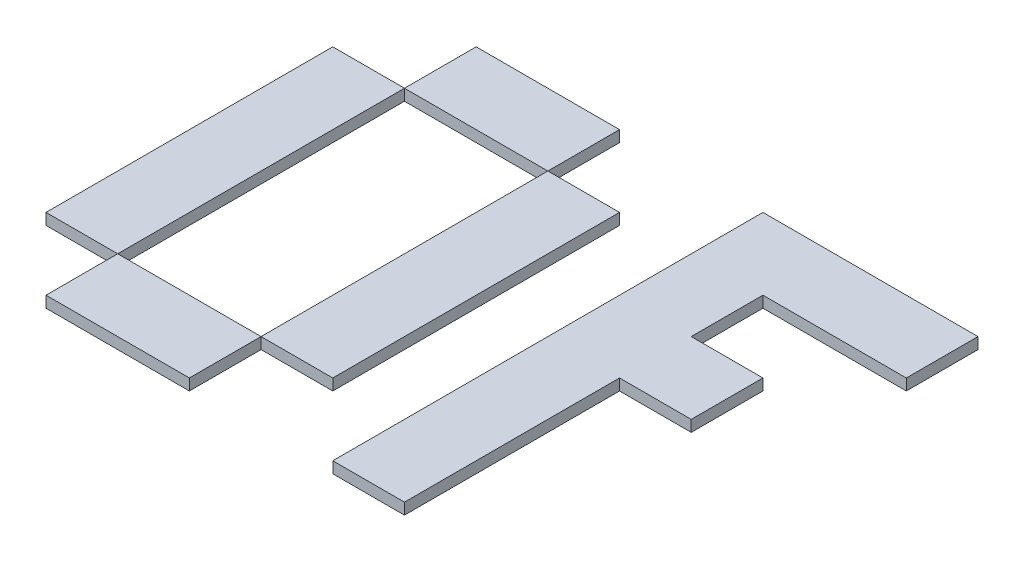
ISO-10303-21;
HEADER;
FILE_DESCRIPTION(('STEP AP214'),'2;1');
FILE_NAME('part.step','',(''),(''),'','','');
FILE_SCHEMA(('AUTOMOTIVE_DESIGN { 1 0 10303 214 1 1 1 1 }'));
ENDSEC;
DATA;
#1=APPLICATION_CONTEXT('core data for automotive mechanical design processes');
#2=APPLICATION_PROTOCOL_DEFINITION('international standard','automotive_design',2000,#1);
#3=PRODUCT_CONTEXT('',#1,'mechanical');
#4=PRODUCT('Part','Part','',(#3));
#5=PRODUCT_RELATED_PRODUCT_CATEGORY('part','',(#4));
#6=PRODUCT_DEFINITION_FORMATION('','',#4);
#7=PRODUCT_DEFINITION_CONTEXT('part definition',#1,'design');
#8=PRODUCT_DEFINITION('design','',#6,#7);
#9=PRODUCT_DEFINITION_SHAPE('','',#8);
#10=(LENGTH_UNIT() NAMED_UNIT(*) SI_UNIT(.MILLI.,.METRE.));
#11=(NAMED_UNIT(*) PLANE_ANGLE_UNIT() SI_UNIT($,.RADIAN.));
#12=(NAMED_UNIT(*) SI_UNIT($,.STERADIAN.) SOLID_ANGLE_UNIT());
#13=UNCERTAINTY_MEASURE_WITH_UNIT(LENGTH_MEASURE(1.E-05),#10,'distance_accuracy_value','');
#14=(GEOMETRIC_REPRESENTATION_CONTEXT(3) GLOBAL_UNCERTAINTY_ASSIGNED_CONTEXT((#13)) GLOBAL_UNIT_ASSIGNED_CONTEXT((#10,
#11,#12)) REPRESENTATION_CONTEXT('',''));
#15=CARTESIAN_POINT('',(0.,0.,0.));
#16=DIRECTION('',(0.,0.,1.));
#17=DIRECTION('',(1.,0.,0.));
#18=AXIS2_PLACEMENT_3D('',#15,#16,#17);
#19=CARTESIAN_POINT('',(0.,0.,0.));
#20=DIRECTION('',(0.,-1.,0.));
#21=DIRECTION('',(0.,0.,-1.));
#22=AXIS2_PLACEMENT_3D('',#19,#20,#21);
#23=PLANE('',#22);
#24=DIRECTION('',(0.,0.,1.));
#25=VECTOR('',#24,1.);
#26=CARTESIAN_POINT('',(25.4,0.,-127.));
#27=LINE('',#26,#25);
#28=CARTESIAN_POINT('',(25.4,0.,-127.));
#29=VERTEX_POINT('',#28);
#30=CARTESIAN_POINT('',(25.4,0.,-76.2));
#31=VERTEX_POINT('',#30);
#32=EDGE_CURVE('E107',#29,#31,#27,.T.);
#33=ORIENTED_EDGE('',*,*,#32,.T.);
#34=DIRECTION('',(1.,0.,0.));
#35=VECTOR('',#34,1.);
#36=CARTESIAN_POINT('',(0.,0.,-76.2));
#37=LINE('',#36,#35);
#38=CARTESIAN_POINT('',(12.7,0.,-76.2));
#39=VERTEX_POINT('',#38);
#40=EDGE_CURVE('E96',#39,#31,#37,.T.);
#41=ORIENTED_EDGE('',*,*,#40,.F.);
#42=DIRECTION('',(0.,0.,1.));
#43=VECTOR('',#42,1.);
#44=CARTESIAN_POINT('',(12.7,0.,0.));
#45=LINE('',#44,#43);
#46=CARTESIAN_POINT('',(12.7,0.,-127.));
#47=VERTEX_POINT('',#46);
#48=EDGE_CURVE('E111',#47,#39,#45,.T.);
#49=ORIENTED_EDGE('',*,*,#48,.F.);
#50=DIRECTION('',(1.,0.,0.));
#51=VECTOR('',#50,1.);
#52=CARTESIAN_POINT('',(0.,0.,-127.));
#53=LINE('',#52,#51);
#54=EDGE_CURVE('E102',#47,#29,#53,.T.);
#55=ORIENTED_EDGE('',*,*,#54,.T.);
#56=EDGE_LOOP('',(#33,#41,#49,#55));
#57=FACE_BOUND('',#56,.T.);
#58=ADVANCED_FACE('F50',(#57),#23,.T.);
#59=CARTESIAN_POINT('',(0.,2.,0.));
#60=DIRECTION('',(0.,-1.,0.));
#61=DIRECTION('',(0.,0.,-1.));
#62=AXIS2_PLACEMENT_3D('',#59,#60,#61);
#63=PLANE('',#62);
#64=DIRECTION('',(1.,0.,0.));
#65=VECTOR('',#64,1.);
#66=CARTESIAN_POINT('',(0.,2.,-76.2));
#67=LINE('',#66,#65);
#68=CARTESIAN_POINT('',(12.7,2.,-76.2));
#69=VERTEX_POINT('',#68);
#70=CARTESIAN_POINT('',(25.4,2.,-76.2));
#71=VERTEX_POINT('',#70);
#72=EDGE_CURVE('E93',#69,#71,#67,.T.);
#73=ORIENTED_EDGE('',*,*,#72,.T.);
#74=DIRECTION('',(0.,0.,1.));
#75=VECTOR('',#74,1.);
#76=CARTESIAN_POINT('',(25.4,2.,-127.));
#77=LINE('',#76,#75);
#78=CARTESIAN_POINT('',(25.4,2.,-127.));
#79=VERTEX_POINT('',#78);
#80=EDGE_CURVE('E59',#79,#71,#77,.T.);
#81=ORIENTED_EDGE('',*,*,#80,.F.);
#82=DIRECTION('',(1.,0.,0.));
#83=VECTOR('',#82,1.);
#84=CARTESIAN_POINT('',(0.,2.,-127.));
#85=LINE('',#84,#83);
#86=CARTESIAN_POINT('',(12.7,2.,-127.));
#87=VERTEX_POINT('',#86);
#88=EDGE_CURVE('E104',#87,#79,#85,.T.);
#89=ORIENTED_EDGE('',*,*,#88,.F.);
#90=DIRECTION('',(0.,0.,1.));
#91=VECTOR('',#90,1.);
#92=CARTESIAN_POINT('',(12.7,2.,0.));
#93=LINE('',#92,#91);
#94=EDGE_CURVE('E101',#87,#69,#93,.T.);
#95=ORIENTED_EDGE('',*,*,#94,.T.);
#96=EDGE_LOOP('',(#73,#81,#89,#95));
#97=FACE_BOUND('',#96,.T.);
#98=ADVANCED_FACE('F99',(#97),#63,.F.);
#99=CARTESIAN_POINT('',(0.,0.,-127.));
#100=DIRECTION('',(0.,0.,1.));
#101=DIRECTION('',(1.,0.,0.));
#102=AXIS2_PLACEMENT_3D('',#99,#100,#101);
#103=PLANE('',#102);
#104=ORIENTED_EDGE('',*,*,#88,.T.);
#105=DIRECTION('',(0.,1.,0.));
#106=VECTOR('',#105,1.);
#107=CARTESIAN_POINT('',(25.4,0.,-127.));
#108=LINE('',#107,#106);
#109=EDGE_CURVE('E12',#29,#79,#108,.T.);
#110=ORIENTED_EDGE('',*,*,#109,.F.);
#111=ORIENTED_EDGE('',*,*,#54,.F.);
#112=DIRECTION('',(0.,1.,0.));
#113=VECTOR('',#112,1.);
#114=CARTESIAN_POINT('',(12.7,0.,-127.));
#115=LINE('',#114,#113);
#116=EDGE_CURVE('E114',#47,#87,#115,.T.);
#117=ORIENTED_EDGE('',*,*,#116,.T.);
#118=EDGE_LOOP('',(#104,#110,#111,#117));
#119=FACE_BOUND('',#118,.T.);
#120=ADVANCED_FACE('F120',(#119),#103,.F.);
#121=CARTESIAN_POINT('',(12.7,0.,0.));
#122=DIRECTION('',(-1.,0.,0.));
#123=DIRECTION('',(0.,0.,1.));
#124=AXIS2_PLACEMENT_3D('',#121,#122,#123);
#125=PLANE('',#124);
#126=ORIENTED_EDGE('',*,*,#94,.F.);
#127=ORIENTED_EDGE('',*,*,#116,.F.);
#128=ORIENTED_EDGE('',*,*,#48,.T.);
#129=DIRECTION('',(0.,1.,0.));
#130=VECTOR('',#129,1.);
#131=CARTESIAN_POINT('',(12.7,0.,-76.2));
#132=LINE('',#131,#130);
#133=EDGE_CURVE('E113',#39,#69,#132,.T.);
#134=ORIENTED_EDGE('',*,*,#133,.T.);
#135=EDGE_LOOP('',(#126,#127,#128,#134));
#136=FACE_BOUND('',#135,.T.);
#137=ADVANCED_FACE('F124',(#136),#125,.T.);
#138=CARTESIAN_POINT('',(0.,0.,-76.2));
#139=DIRECTION('',(0.,0.,1.));
#140=DIRECTION('',(1.,0.,0.));
#141=AXIS2_PLACEMENT_3D('',#138,#139,#140);
#142=PLANE('',#141);
#143=ORIENTED_EDGE('',*,*,#72,.F.);
#144=ORIENTED_EDGE('',*,*,#133,.F.);
#145=ORIENTED_EDGE('',*,*,#40,.T.);
#146=DIRECTION('',(0.,1.,0.));
#147=VECTOR('',#146,1.);
#148=CARTESIAN_POINT('',(25.4,0.,-76.2));
#149=LINE('',#148,#147);
#150=EDGE_CURVE('E53',#31,#71,#149,.T.);
#151=ORIENTED_EDGE('',*,*,#150,.T.);
#152=EDGE_LOOP('',(#143,#144,#145,#151));
#153=FACE_BOUND('',#152,.T.);
#154=ADVANCED_FACE('F91',(#153),#142,.T.);
#155=CARTESIAN_POINT('',(25.4,0.,-127.));
#156=DIRECTION('',(-1.,0.,0.));
#157=DIRECTION('',(0.,0.,1.));
#158=AXIS2_PLACEMENT_3D('',#155,#156,#157);
#159=PLANE('',#158);
#160=ORIENTED_EDGE('',*,*,#80,.T.);
#161=ORIENTED_EDGE('',*,*,#150,.F.);
#162=ORIENTED_EDGE('',*,*,#32,.F.);
#163=ORIENTED_EDGE('',*,*,#109,.T.);
#164=EDGE_LOOP('',(#160,#161,#162,#163));
#165=FACE_BOUND('',#164,.T.);
#166=ADVANCED_FACE('F84',(#165),#159,.F.);
#167=CLOSED_SHELL('',(#58,#98,#120,#137,#154,#166));
#168=MANIFOLD_SOLID_BREP('B2',#167);
#169=CARTESIAN_POINT('',(0.,0.,-63.5));
#170=DIRECTION('',(0.,0.,1.));
#171=DIRECTION('',(1.,0.,0.));
#172=AXIS2_PLACEMENT_3D('',#169,#170,#171);
#173=PLANE('',#172);
#174=DIRECTION('',(1.,0.,0.));
#175=VECTOR('',#174,1.);
#176=CARTESIAN_POINT('',(0.,2.,-63.5));
#177=LINE('',#176,#175);
#178=CARTESIAN_POINT('',(25.4,2.,-63.5));
#179=VERTEX_POINT('',#178);
#180=CARTESIAN_POINT('',(50.8,2.,-63.5));
#181=VERTEX_POINT('',#180);
#182=EDGE_CURVE('E259',#179,#181,#177,.T.);
#183=ORIENTED_EDGE('',*,*,#182,.F.);
#184=DIRECTION('',(0.,1.,0.));
#185=VECTOR('',#184,1.);
#186=CARTESIAN_POINT('',(25.4,0.,-63.5));
#187=LINE('',#186,#185);
#188=CARTESIAN_POINT('',(25.4,0.,-63.5));
#189=VERTEX_POINT('',#188);
#190=EDGE_CURVE('E249',#189,#179,#187,.T.);
#191=ORIENTED_EDGE('',*,*,#190,.F.);
#192=DIRECTION('',(1.,0.,0.));
#193=VECTOR('',#192,1.);
#194=CARTESIAN_POINT('',(0.,0.,-63.5));
#195=LINE('',#194,#193);
#196=CARTESIAN_POINT('',(50.8,0.,-63.5));
#197=VERTEX_POINT('',#196);
#198=EDGE_CURVE('E255',#189,#197,#195,.T.);
#199=ORIENTED_EDGE('',*,*,#198,.T.);
#200=DIRECTION('',(0.,1.,0.));
#201=VECTOR('',#200,1.);
#202=CARTESIAN_POINT('',(50.8,0.,-63.5));
#203=LINE('',#202,#201);
#204=EDGE_CURVE('E244',#197,#181,#203,.T.);
#205=ORIENTED_EDGE('',*,*,#204,.T.);
#206=EDGE_LOOP('',(#183,#191,#199,#205));
#207=FACE_BOUND('',#206,.T.);
#208=ADVANCED_FACE('F196',(#207),#173,.T.);
#209=CARTESIAN_POINT('',(0.,2.,0.));
#210=DIRECTION('',(0.,-1.,0.));
#211=DIRECTION('',(0.,0.,-1.));
#212=AXIS2_PLACEMENT_3D('',#209,#210,#211);
#213=PLANE('',#212);
#214=DIRECTION('',(0.,0.,1.));
#215=VECTOR('',#214,1.);
#216=CARTESIAN_POINT('',(50.8,2.,0.));
#217=LINE('',#216,#215);
#218=CARTESIAN_POINT('',(50.8,2.,-76.2));
#219=VERTEX_POINT('',#218);
#220=EDGE_CURVE('E239',#219,#181,#217,.T.);
#221=ORIENTED_EDGE('',*,*,#220,.F.);
#222=DIRECTION('',(1.,0.,0.));
#223=VECTOR('',#222,1.);
#224=CARTESIAN_POINT('',(25.4,2.,-76.2));
#225=LINE('',#224,#223);
#226=CARTESIAN_POINT('',(25.4,2.,-76.2));
#227=VERTEX_POINT('',#226);
#228=EDGE_CURVE('E205',#227,#219,#225,.T.);
#229=ORIENTED_EDGE('',*,*,#228,.F.);
#230=DIRECTION('',(0.,0.,1.));
#231=VECTOR('',#230,1.);
#232=CARTESIAN_POINT('',(25.4,2.,0.));
#233=LINE('',#232,#231);
#234=EDGE_CURVE('E262',#227,#179,#233,.T.);
#235=ORIENTED_EDGE('',*,*,#234,.T.);
#236=ORIENTED_EDGE('',*,*,#182,.T.);
#237=EDGE_LOOP('',(#221,#229,#235,#236));
#238=FACE_BOUND('',#237,.T.);
#239=ADVANCED_FACE('F268',(#238),#213,.F.);
#240=CARTESIAN_POINT('',(50.8,0.,0.));
#241=DIRECTION('',(-1.,0.,0.));
#242=DIRECTION('',(0.,0.,1.));
#243=AXIS2_PLACEMENT_3D('',#240,#241,#242);
#244=PLANE('',#243);
#245=ORIENTED_EDGE('',*,*,#220,.T.);
#246=ORIENTED_EDGE('',*,*,#204,.F.);
#247=DIRECTION('',(0.,0.,1.));
#248=VECTOR('',#247,1.);
#249=CARTESIAN_POINT('',(50.8,0.,0.));
#250=LINE('',#249,#248);
#251=CARTESIAN_POINT('',(50.8,0.,-76.2));
#252=VERTEX_POINT('',#251);
#253=EDGE_CURVE('E242',#252,#197,#250,.T.);
#254=ORIENTED_EDGE('',*,*,#253,.F.);
#255=DIRECTION('',(0.,1.,0.));
#256=VECTOR('',#255,1.);
#257=CARTESIAN_POINT('',(50.8,0.,-76.2));
#258=LINE('',#257,#256);
#259=EDGE_CURVE('E230',#252,#219,#258,.T.);
#260=ORIENTED_EDGE('',*,*,#259,.T.);
#261=EDGE_LOOP('',(#245,#246,#254,#260));
#262=FACE_BOUND('',#261,.T.);
#263=ADVANCED_FACE('F243',(#262),#244,.F.);
#264=CARTESIAN_POINT('',(25.4,0.,0.));
#265=DIRECTION('',(-1.,0.,0.));
#266=DIRECTION('',(0.,0.,1.));
#267=AXIS2_PLACEMENT_3D('',#264,#265,#266);
#268=PLANE('',#267);
#269=ORIENTED_EDGE('',*,*,#234,.F.);
#270=DIRECTION('',(0.,1.,0.));
#271=VECTOR('',#270,1.);
#272=CARTESIAN_POINT('',(25.4,0.,-76.2));
#273=LINE('',#272,#271);
#274=CARTESIAN_POINT('',(25.4,0.,-76.2));
#275=VERTEX_POINT('',#274);
#276=EDGE_CURVE('E48',#275,#227,#273,.T.);
#277=ORIENTED_EDGE('',*,*,#276,.F.);
#278=DIRECTION('',(0.,0.,1.));
#279=VECTOR('',#278,1.);
#280=CARTESIAN_POINT('',(25.4,0.,0.));
#281=LINE('',#280,#279);
#282=EDGE_CURVE('E238',#275,#189,#281,.T.);
#283=ORIENTED_EDGE('',*,*,#282,.T.);
#284=ORIENTED_EDGE('',*,*,#190,.T.);
#285=EDGE_LOOP('',(#269,#277,#283,#284));
#286=FACE_BOUND('',#285,.T.);
#287=ADVANCED_FACE('F270',(#286),#268,.T.);
#288=CARTESIAN_POINT('',(0.,0.,0.));
#289=DIRECTION('',(0.,-1.,0.));
#290=DIRECTION('',(0.,0.,-1.));
#291=AXIS2_PLACEMENT_3D('',#288,#289,#290);
#292=PLANE('',#291);
#293=DIRECTION('',(1.,0.,0.));
#294=VECTOR('',#293,1.);
#295=CARTESIAN_POINT('',(25.4,0.,-76.2));
#296=LINE('',#295,#294);
#297=EDGE_CURVE('E234',#275,#252,#296,.T.);
#298=ORIENTED_EDGE('',*,*,#297,.T.);
#299=ORIENTED_EDGE('',*,*,#253,.T.);
#300=ORIENTED_EDGE('',*,*,#198,.F.);
#301=ORIENTED_EDGE('',*,*,#282,.F.);
#302=EDGE_LOOP('',(#298,#299,#300,#301));
#303=FACE_BOUND('',#302,.T.);
#304=ADVANCED_FACE('F198',(#303),#292,.T.);
#305=CARTESIAN_POINT('',(25.4,0.,-76.2));
#306=DIRECTION('',(0.,0.,1.));
#307=DIRECTION('',(1.,0.,0.));
#308=AXIS2_PLACEMENT_3D('',#305,#306,#307);
#309=PLANE('',#308);
#310=ORIENTED_EDGE('',*,*,#228,.T.);
#311=ORIENTED_EDGE('',*,*,#259,.F.);
#312=ORIENTED_EDGE('',*,*,#297,.F.);
#313=ORIENTED_EDGE('',*,*,#276,.T.);
#314=EDGE_LOOP('',(#310,#311,#312,#313));
#315=FACE_BOUND('',#314,.T.);
#316=ADVANCED_FACE('F232',(#315),#309,.F.);
#317=CLOSED_SHELL('',(#208,#239,#263,#287,#304,#316));
#318=MANIFOLD_SOLID_BREP('B6',#317);
#319=CARTESIAN_POINT('',(63.5,0.,0.));
#320=DIRECTION('',(-1.,0.,0.));
#321=DIRECTION('',(0.,0.,1.));
#322=AXIS2_PLACEMENT_3D('',#319,#320,#321);
#323=PLANE('',#322);
#324=DIRECTION('',(0.,0.,1.));
#325=VECTOR('',#324,1.);
#326=CARTESIAN_POINT('',(63.5,2.,0.));
#327=LINE('',#326,#325);
#328=CARTESIAN_POINT('',(63.5,2.,-127.));
#329=VERTEX_POINT('',#328);
#330=CARTESIAN_POINT('',(63.5,2.,-76.2));
#331=VERTEX_POINT('',#330);
#332=EDGE_CURVE('E405',#329,#331,#327,.T.);
#333=ORIENTED_EDGE('',*,*,#332,.T.);
#334=DIRECTION('',(0.,1.,0.));
#335=VECTOR('',#334,1.);
#336=CARTESIAN_POINT('',(63.5,0.,-76.2));
#337=LINE('',#336,#335);
#338=CARTESIAN_POINT('',(63.5,0.,-76.2));
#339=VERTEX_POINT('',#338);
#340=EDGE_CURVE('E402',#339,#331,#337,.T.);
#341=ORIENTED_EDGE('',*,*,#340,.F.);
#342=DIRECTION('',(0.,0.,1.));
#343=VECTOR('',#342,1.);
#344=CARTESIAN_POINT('',(63.5,0.,0.));
#345=LINE('',#344,#343);
#346=CARTESIAN_POINT('',(63.5,0.,-127.));
#347=VERTEX_POINT('',#346);
#348=EDGE_CURVE('E393',#347,#339,#345,.T.);
#349=ORIENTED_EDGE('',*,*,#348,.F.);
#350=DIRECTION('',(0.,1.,0.));
#351=VECTOR('',#350,1.);
#352=CARTESIAN_POINT('',(63.5,0.,-127.));
#353=LINE('',#352,#351);
#354=EDGE_CURVE('E389',#347,#329,#353,.T.);
#355=ORIENTED_EDGE('',*,*,#354,.T.);
#356=EDGE_LOOP('',(#333,#341,#349,#355));
#357=FACE_BOUND('',#356,.T.);
#358=ADVANCED_FACE('F342',(#357),#323,.F.);
#359=CARTESIAN_POINT('',(0.,2.,0.));
#360=DIRECTION('',(0.,-1.,0.));
#361=DIRECTION('',(0.,0.,-1.));
#362=AXIS2_PLACEMENT_3D('',#359,#360,#361);
#363=PLANE('',#362);
#364=DIRECTION('',(1.,0.,0.));
#365=VECTOR('',#364,1.);
#366=CARTESIAN_POINT('',(0.,2.,-127.));
#367=LINE('',#366,#365);
#368=CARTESIAN_POINT('',(50.8,2.,-127.));
#369=VERTEX_POINT('',#368);
#370=EDGE_CURVE('E384',#369,#329,#367,.T.);
#371=ORIENTED_EDGE('',*,*,#370,.F.);
#372=DIRECTION('',(0.,0.,-1.));
#373=VECTOR('',#372,1.);
#374=CARTESIAN_POINT('',(50.8,2.,-127.));
#375=LINE('',#374,#373);
#376=CARTESIAN_POINT('',(50.8,2.,-76.2));
#377=VERTEX_POINT('',#376);
#378=EDGE_CURVE('E352',#377,#369,#375,.T.);
#379=ORIENTED_EDGE('',*,*,#378,.F.);
#380=DIRECTION('',(1.,0.,0.));
#381=VECTOR('',#380,1.);
#382=CARTESIAN_POINT('',(0.,2.,-76.2));
#383=LINE('',#382,#381);
#384=EDGE_CURVE('E403',#377,#331,#383,.T.);
#385=ORIENTED_EDGE('',*,*,#384,.T.);
#386=ORIENTED_EDGE('',*,*,#332,.F.);
#387=EDGE_LOOP('',(#371,#379,#385,#386));
#388=FACE_BOUND('',#387,.T.);
#389=ADVANCED_FACE('F414',(#388),#363,.F.);
#390=CARTESIAN_POINT('',(0.,0.,-76.2));
#391=DIRECTION('',(0.,0.,1.));
#392=DIRECTION('',(1.,0.,0.));
#393=AXIS2_PLACEMENT_3D('',#390,#391,#392);
#394=PLANE('',#393);
#395=ORIENTED_EDGE('',*,*,#384,.F.);
#396=DIRECTION('',(0.,1.,0.));
#397=VECTOR('',#396,1.);
#398=CARTESIAN_POINT('',(50.8,0.,-76.2));
#399=LINE('',#398,#397);
#400=CARTESIAN_POINT('',(50.8,0.,-76.2));
#401=VERTEX_POINT('',#400);
#402=EDGE_CURVE('E194',#401,#377,#399,.T.);
#403=ORIENTED_EDGE('',*,*,#402,.F.);
#404=DIRECTION('',(1.,0.,0.));
#405=VECTOR('',#404,1.);
#406=CARTESIAN_POINT('',(0.,0.,-76.2));
#407=LINE('',#406,#405);
#408=EDGE_CURVE('E397',#401,#339,#407,.T.);
#409=ORIENTED_EDGE('',*,*,#408,.T.);
#410=ORIENTED_EDGE('',*,*,#340,.T.);
#411=EDGE_LOOP('',(#395,#403,#409,#410));
#412=FACE_BOUND('',#411,.T.);
#413=ADVANCED_FACE('F416',(#412),#394,.T.);
#414=CARTESIAN_POINT('',(0.,0.,-127.));
#415=DIRECTION('',(0.,0.,1.));
#416=DIRECTION('',(1.,0.,0.));
#417=AXIS2_PLACEMENT_3D('',#414,#415,#416);
#418=PLANE('',#417);
#419=ORIENTED_EDGE('',*,*,#370,.T.);
#420=ORIENTED_EDGE('',*,*,#354,.F.);
#421=DIRECTION('',(1.,0.,0.));
#422=VECTOR('',#421,1.);
#423=CARTESIAN_POINT('',(0.,0.,-127.));
#424=LINE('',#423,#422);
#425=CARTESIAN_POINT('',(50.8,0.,-127.));
#426=VERTEX_POINT('',#425);
#427=EDGE_CURVE('E386',#426,#347,#424,.T.);
#428=ORIENTED_EDGE('',*,*,#427,.F.);
#429=DIRECTION('',(0.,1.,0.));
#430=VECTOR('',#429,1.);
#431=CARTESIAN_POINT('',(50.8,0.,-127.));
#432=LINE('',#431,#430);
#433=EDGE_CURVE('E346',#426,#369,#432,.T.);
#434=ORIENTED_EDGE('',*,*,#433,.T.);
#435=EDGE_LOOP('',(#419,#420,#428,#434));
#436=FACE_BOUND('',#435,.T.);
#437=ADVANCED_FACE('F387',(#436),#418,.F.);
#438=CARTESIAN_POINT('',(0.,0.,0.));
#439=DIRECTION('',(0.,-1.,0.));
#440=DIRECTION('',(0.,0.,-1.));
#441=AXIS2_PLACEMENT_3D('',#438,#439,#440);
#442=PLANE('',#441);
#443=DIRECTION('',(0.,0.,-1.));
#444=VECTOR('',#443,1.);
#445=CARTESIAN_POINT('',(50.8,0.,-127.));
#446=LINE('',#445,#444);
#447=EDGE_CURVE('E381',#401,#426,#446,.T.);
#448=ORIENTED_EDGE('',*,*,#447,.T.);
#449=ORIENTED_EDGE('',*,*,#427,.T.);
#450=ORIENTED_EDGE('',*,*,#348,.T.);
#451=ORIENTED_EDGE('',*,*,#408,.F.);
#452=EDGE_LOOP('',(#448,#449,#450,#451));
#453=FACE_BOUND('',#452,.T.);
#454=ADVANCED_FACE('F344',(#453),#442,.T.);
#455=CARTESIAN_POINT('',(50.8,0.,-127.));
#456=DIRECTION('',(1.,0.,0.));
#457=DIRECTION('',(0.,0.,-1.));
#458=AXIS2_PLACEMENT_3D('',#455,#456,#457);
#459=PLANE('',#458);
#460=ORIENTED_EDGE('',*,*,#378,.T.);
#461=ORIENTED_EDGE('',*,*,#433,.F.);
#462=ORIENTED_EDGE('',*,*,#447,.F.);
#463=ORIENTED_EDGE('',*,*,#402,.T.);
#464=EDGE_LOOP('',(#460,#461,#462,#463));
#465=FACE_BOUND('',#464,.T.);
#466=ADVANCED_FACE('F379',(#465),#459,.F.);
#467=CLOSED_SHELL('',(#358,#389,#413,#437,#454,#466));
#468=MANIFOLD_SOLID_BREP('B42',#467);
#469=CARTESIAN_POINT('',(0.,0.,0.));
#470=DIRECTION('',(0.,-1.,0.));
#471=DIRECTION('',(0.,0.,-1.));
#472=AXIS2_PLACEMENT_3D('',#469,#470,#471);
#473=PLANE('',#472);
#474=DIRECTION('',(0.,0.,1.));
#475=VECTOR('',#474,1.);
#476=CARTESIAN_POINT('',(101.6,0.,-1.11022302462516E-13));
#477=LINE('',#476,#475);
#478=CARTESIAN_POINT('',(101.6,0.,-114.3));
#479=VERTEX_POINT('',#478);
#480=CARTESIAN_POINT('',(101.6,0.,-101.6));
#481=VERTEX_POINT('',#480);
#482=EDGE_CURVE('E585',#479,#481,#477,.T.);
#483=ORIENTED_EDGE('',*,*,#482,.T.);
#484=DIRECTION('',(1.,0.,0.));
#485=VECTOR('',#484,1.);
#486=CARTESIAN_POINT('',(0.,0.,-101.6));
#487=LINE('',#486,#485);
#488=CARTESIAN_POINT('',(88.9,0.,-101.6));
#489=VERTEX_POINT('',#488);
#490=EDGE_CURVE('E491',#489,#481,#487,.T.);
#491=ORIENTED_EDGE('',*,*,#490,.F.);
#492=DIRECTION('',(0.,0.,1.));
#493=VECTOR('',#492,1.);
#494=CARTESIAN_POINT('',(88.9,0.,0.));
#495=LINE('',#494,#493);
#496=CARTESIAN_POINT('',(88.9,0.,-63.5));
#497=VERTEX_POINT('',#496);
#498=EDGE_CURVE('E570',#489,#497,#495,.T.);
#499=ORIENTED_EDGE('',*,*,#498,.T.);
#500=DIRECTION('',(1.,0.,0.));
#501=VECTOR('',#500,1.);
#502=CARTESIAN_POINT('',(0.,0.,-63.5));
#503=LINE('',#502,#501);
#504=CARTESIAN_POINT('',(76.2,0.,-63.5));
#505=VERTEX_POINT('',#504);
#506=EDGE_CURVE('E575',#505,#497,#503,.T.);
#507=ORIENTED_EDGE('',*,*,#506,.F.);
#508=DIRECTION('',(0.,0.,-1.));
#509=VECTOR('',#508,1.);
#510=CARTESIAN_POINT('',(76.2,0.,0.));
#511=LINE('',#510,#509);
#512=CARTESIAN_POINT('',(76.2,0.,-139.7));
#513=VERTEX_POINT('',#512);
#514=EDGE_CURVE('E584',#505,#513,#511,.T.);
#515=ORIENTED_EDGE('',*,*,#514,.T.);
#516=DIRECTION('',(1.,0.,0.));
#517=VECTOR('',#516,1.);
#518=CARTESIAN_POINT('',(0.,0.,-139.7));
#519=LINE('',#518,#517);
#520=CARTESIAN_POINT('',(114.3,0.,-139.7));
#521=VERTEX_POINT('',#520);
#522=EDGE_CURVE('E586',#513,#521,#519,.T.);
#523=ORIENTED_EDGE('',*,*,#522,.T.);
#524=DIRECTION('',(0.,0.,1.));
#525=VECTOR('',#524,1.);
#526=CARTESIAN_POINT('',(114.3,0.,3.74700270810989E-13));
#527=LINE('',#526,#525);
#528=CARTESIAN_POINT('',(114.3,0.,-127.));
#529=VERTEX_POINT('',#528);
#530=EDGE_CURVE('E592',#521,#529,#527,.T.);
#531=ORIENTED_EDGE('',*,*,#530,.T.);
#532=DIRECTION('',(1.,0.,0.));
#533=VECTOR('',#532,1.);
#534=CARTESIAN_POINT('',(0.,0.,-127.));
#535=LINE('',#534,#533);
#536=CARTESIAN_POINT('',(88.9,0.,-127.));
#537=VERTEX_POINT('',#536);
#538=EDGE_CURVE('E596',#537,#529,#535,.T.);
#539=ORIENTED_EDGE('',*,*,#538,.F.);
#540=DIRECTION('',(0.,0.,1.));
#541=VECTOR('',#540,1.);
#542=CARTESIAN_POINT('',(88.9000000000001,0.,0.));
#543=LINE('',#542,#541);
#544=CARTESIAN_POINT('',(88.9,0.,-114.3));
#545=VERTEX_POINT('',#544);
#546=EDGE_CURVE('E595',#537,#545,#543,.T.);
#547=ORIENTED_EDGE('',*,*,#546,.T.);
#548=DIRECTION('',(1.,0.,0.));
#549=VECTOR('',#548,1.);
#550=CARTESIAN_POINT('',(0.,0.,-114.3));
#551=LINE('',#550,#549);
#552=EDGE_CURVE('E602',#545,#479,#551,.T.);
#553=ORIENTED_EDGE('',*,*,#552,.T.);
#554=EDGE_LOOP('',(#483,#491,#499,#507,#515,#523,#531,#539,#547,#553));
#555=FACE_BOUND('',#554,.T.);
#556=ADVANCED_FACE('F487',(#555),#473,.T.);
#557=CARTESIAN_POINT('',(88.9,0.,0.));
#558=DIRECTION('',(-1.,0.,0.));
#559=DIRECTION('',(0.,0.,1.));
#560=AXIS2_PLACEMENT_3D('',#557,#558,#559);
#561=PLANE('',#560);
#562=DIRECTION('',(0.,0.,1.));
#563=VECTOR('',#562,1.);
#564=CARTESIAN_POINT('',(88.9,2.,0.));
#565=LINE('',#564,#563);
#566=CARTESIAN_POINT('',(88.9,2.,-101.6));
#567=VERTEX_POINT('',#566);
#568=CARTESIAN_POINT('',(88.9,2.,-63.5));
#569=VERTEX_POINT('',#568);
#570=EDGE_CURVE('E573',#567,#569,#565,.T.);
#571=ORIENTED_EDGE('',*,*,#570,.T.);
#572=DIRECTION('',(0.,1.,0.));
#573=VECTOR('',#572,1.);
#574=CARTESIAN_POINT('',(88.9,0.,-63.5));
#575=LINE('',#574,#573);
#576=EDGE_CURVE('E566',#497,#569,#575,.T.);
#577=ORIENTED_EDGE('',*,*,#576,.F.);
#578=ORIENTED_EDGE('',*,*,#498,.F.);
#579=DIRECTION('',(0.,1.,0.));
#580=VECTOR('',#579,1.);
#581=CARTESIAN_POINT('',(88.9,0.,-101.6));
#582=LINE('',#581,#580);
#583=EDGE_CURVE('E581',#489,#567,#582,.T.);
#584=ORIENTED_EDGE('',*,*,#583,.T.);
#585=EDGE_LOOP('',(#571,#577,#578,#584));
#586=FACE_BOUND('',#585,.T.);
#587=ADVANCED_FACE('F567',(#586),#561,.F.);
#588=CARTESIAN_POINT('',(0.,0.,-63.5));
#589=DIRECTION('',(0.,0.,1.));
#590=DIRECTION('',(1.,0.,0.));
#591=AXIS2_PLACEMENT_3D('',#588,#589,#590);
#592=PLANE('',#591);
#593=DIRECTION('',(1.,0.,0.));
#594=VECTOR('',#593,1.);
#595=CARTESIAN_POINT('',(0.,2.,-63.5));
#596=LINE('',#595,#594);
#597=CARTESIAN_POINT('',(76.2,2.,-63.5));
#598=VERTEX_POINT('',#597);
#599=EDGE_CURVE('E340',#598,#569,#596,.T.);
#600=ORIENTED_EDGE('',*,*,#599,.F.);
#601=DIRECTION('',(0.,1.,0.));
#602=VECTOR('',#601,1.);
#603=CARTESIAN_POINT('',(76.2,0.,-63.5));
#604=LINE('',#603,#602);
#605=EDGE_CURVE('E560',#505,#598,#604,.T.);
#606=ORIENTED_EDGE('',*,*,#605,.F.);
#607=ORIENTED_EDGE('',*,*,#506,.T.);
#608=ORIENTED_EDGE('',*,*,#576,.T.);
#609=EDGE_LOOP('',(#600,#606,#607,#608));
#610=FACE_BOUND('',#609,.T.);
#611=ADVANCED_FACE('F578',(#610),#592,.T.);
#612=CARTESIAN_POINT('',(76.2,0.,0.));
#613=DIRECTION('',(1.,0.,0.));
#614=DIRECTION('',(0.,0.,-1.));
#615=AXIS2_PLACEMENT_3D('',#612,#613,#614);
#616=PLANE('',#615);
#617=DIRECTION('',(0.,0.,-1.));
#618=VECTOR('',#617,1.);
#619=CARTESIAN_POINT('',(76.2,2.,0.));
#620=LINE('',#619,#618);
#621=CARTESIAN_POINT('',(76.2,2.,-139.7));
#622=VERTEX_POINT('',#621);
#623=EDGE_CURVE('E574',#598,#622,#620,.T.);
#624=ORIENTED_EDGE('',*,*,#623,.T.);
#625=DIRECTION('',(0.,1.,0.));
#626=VECTOR('',#625,1.);
#627=CARTESIAN_POINT('',(76.2,0.,-139.7));
#628=LINE('',#627,#626);
#629=EDGE_CURVE('E614',#513,#622,#628,.T.);
#630=ORIENTED_EDGE('',*,*,#629,.F.);
#631=ORIENTED_EDGE('',*,*,#514,.F.);
#632=ORIENTED_EDGE('',*,*,#605,.T.);
#633=EDGE_LOOP('',(#624,#630,#631,#632));
#634=FACE_BOUND('',#633,.T.);
#635=ADVANCED_FACE('F646',(#634),#616,.F.);
#636=CARTESIAN_POINT('',(0.,0.,-139.7));
#637=DIRECTION('',(0.,0.,1.));
#638=DIRECTION('',(1.,0.,0.));
#639=AXIS2_PLACEMENT_3D('',#636,#637,#638);
#640=PLANE('',#639);
#641=DIRECTION('',(1.,0.,0.));
#642=VECTOR('',#641,1.);
#643=CARTESIAN_POINT('',(0.,2.,-139.7));
#644=LINE('',#643,#642);
#645=CARTESIAN_POINT('',(114.3,2.,-139.7));
#646=VERTEX_POINT('',#645);
#647=EDGE_CURVE('E611',#622,#646,#644,.T.);
#648=ORIENTED_EDGE('',*,*,#647,.T.);
#649=DIRECTION('',(0.,1.,0.));
#650=VECTOR('',#649,1.);
#651=CARTESIAN_POINT('',(114.3,0.,-139.7));
#652=LINE('',#651,#650);
#653=EDGE_CURVE('E599',#521,#646,#652,.T.);
#654=ORIENTED_EDGE('',*,*,#653,.F.);
#655=ORIENTED_EDGE('',*,*,#522,.F.);
#656=ORIENTED_EDGE('',*,*,#629,.T.);
#657=EDGE_LOOP('',(#648,#654,#655,#656));
#658=FACE_BOUND('',#657,.T.);
#659=ADVANCED_FACE('F651',(#658),#640,.F.);
#660=CARTESIAN_POINT('',(114.3,0.,3.74700270810989E-13));
#661=DIRECTION('',(-1.,0.,0.));
#662=DIRECTION('',(0.,0.,1.));
#663=AXIS2_PLACEMENT_3D('',#660,#661,#662);
#664=PLANE('',#663);
#665=DIRECTION('',(0.,0.,1.));
#666=VECTOR('',#665,1.);
#667=CARTESIAN_POINT('',(114.3,2.,3.74700270810989E-13));
#668=LINE('',#667,#666);
#669=CARTESIAN_POINT('',(114.3,2.,-127.));
#670=VERTEX_POINT('',#669);
#671=EDGE_CURVE('E615',#646,#670,#668,.T.);
#672=ORIENTED_EDGE('',*,*,#671,.T.);
#673=DIRECTION('',(0.,1.,0.));
#674=VECTOR('',#673,1.);
#675=CARTESIAN_POINT('',(114.3,0.,-127.));
#676=LINE('',#675,#674);
#677=EDGE_CURVE('E598',#529,#670,#676,.T.);
#678=ORIENTED_EDGE('',*,*,#677,.F.);
#679=ORIENTED_EDGE('',*,*,#530,.F.);
#680=ORIENTED_EDGE('',*,*,#653,.T.);
#681=EDGE_LOOP('',(#672,#678,#679,#680));
#682=FACE_BOUND('',#681,.T.);
#683=ADVANCED_FACE('F654',(#682),#664,.F.);
#684=CARTESIAN_POINT('',(0.,0.,-127.));
#685=DIRECTION('',(0.,0.,1.));
#686=DIRECTION('',(1.,0.,0.));
#687=AXIS2_PLACEMENT_3D('',#684,#685,#686);
#688=PLANE('',#687);
#689=DIRECTION('',(1.,0.,0.));
#690=VECTOR('',#689,1.);
#691=CARTESIAN_POINT('',(0.,2.,-127.));
#692=LINE('',#691,#690);
#693=CARTESIAN_POINT('',(88.9,2.,-127.));
#694=VERTEX_POINT('',#693);
#695=EDGE_CURVE('E497',#694,#670,#692,.T.);
#696=ORIENTED_EDGE('',*,*,#695,.F.);
#697=DIRECTION('',(0.,1.,0.));
#698=VECTOR('',#697,1.);
#699=CARTESIAN_POINT('',(88.9,0.,-127.));
#700=LINE('',#699,#698);
#701=EDGE_CURVE('E623',#537,#694,#700,.T.);
#702=ORIENTED_EDGE('',*,*,#701,.F.);
#703=ORIENTED_EDGE('',*,*,#538,.T.);
#704=ORIENTED_EDGE('',*,*,#677,.T.);
#705=EDGE_LOOP('',(#696,#702,#703,#704));
#706=FACE_BOUND('',#705,.T.);
#707=ADVANCED_FACE('F657',(#706),#688,.T.);
#708=CARTESIAN_POINT('',(88.9000000000001,0.,0.));
#709=DIRECTION('',(-1.,0.,0.));
#710=DIRECTION('',(0.,0.,1.));
#711=AXIS2_PLACEMENT_3D('',#708,#709,#710);
#712=PLANE('',#711);
#713=DIRECTION('',(0.,0.,1.));
#714=VECTOR('',#713,1.);
#715=CARTESIAN_POINT('',(88.9000000000001,2.,0.));
#716=LINE('',#715,#714);
#717=CARTESIAN_POINT('',(88.9,2.,-114.3));
#718=VERTEX_POINT('',#717);
#719=EDGE_CURVE('E620',#694,#718,#716,.T.);
#720=ORIENTED_EDGE('',*,*,#719,.T.);
#721=DIRECTION('',(0.,1.,0.));
#722=VECTOR('',#721,1.);
#723=CARTESIAN_POINT('',(88.9,0.,-114.3));
#724=LINE('',#723,#722);
#725=EDGE_CURVE('E627',#545,#718,#724,.T.);
#726=ORIENTED_EDGE('',*,*,#725,.F.);
#727=ORIENTED_EDGE('',*,*,#546,.F.);
#728=ORIENTED_EDGE('',*,*,#701,.T.);
#729=EDGE_LOOP('',(#720,#726,#727,#728));
#730=FACE_BOUND('',#729,.T.);
#731=ADVANCED_FACE('F662',(#730),#712,.F.);
#732=CARTESIAN_POINT('',(0.,0.,-114.3));
#733=DIRECTION('',(0.,0.,1.));
#734=DIRECTION('',(1.,0.,0.));
#735=AXIS2_PLACEMENT_3D('',#732,#733,#734);
#736=PLANE('',#735);
#737=DIRECTION('',(1.,0.,0.));
#738=VECTOR('',#737,1.);
#739=CARTESIAN_POINT('',(0.,2.,-114.3));
#740=LINE('',#739,#738);
#741=CARTESIAN_POINT('',(101.6,2.,-114.3));
#742=VERTEX_POINT('',#741);
#743=EDGE_CURVE('E624',#718,#742,#740,.T.);
#744=ORIENTED_EDGE('',*,*,#743,.T.);
#745=DIRECTION('',(0.,1.,0.));
#746=VECTOR('',#745,1.);
#747=CARTESIAN_POINT('',(101.6,0.,-114.3));
#748=LINE('',#747,#746);
#749=EDGE_CURVE('E630',#479,#742,#748,.T.);
#750=ORIENTED_EDGE('',*,*,#749,.F.);
#751=ORIENTED_EDGE('',*,*,#552,.F.);
#752=ORIENTED_EDGE('',*,*,#725,.T.);
#753=EDGE_LOOP('',(#744,#750,#751,#752));
#754=FACE_BOUND('',#753,.T.);
#755=ADVANCED_FACE('F665',(#754),#736,.F.);
#756=CARTESIAN_POINT('',(101.6,0.,-1.11022302462516E-13));
#757=DIRECTION('',(-1.,0.,0.));
#758=DIRECTION('',(0.,0.,1.));
#759=AXIS2_PLACEMENT_3D('',#756,#757,#758);
#760=PLANE('',#759);
#761=DIRECTION('',(0.,0.,1.));
#762=VECTOR('',#761,1.);
#763=CARTESIAN_POINT('',(101.6,2.,-1.11022302462516E-13));
#764=LINE('',#763,#762);
#765=CARTESIAN_POINT('',(101.6,2.,-101.6));
#766=VERTEX_POINT('',#765);
#767=EDGE_CURVE('E628',#742,#766,#764,.T.);
#768=ORIENTED_EDGE('',*,*,#767,.T.);
#769=DIRECTION('',(0.,1.,0.));
#770=VECTOR('',#769,1.);
#771=CARTESIAN_POINT('',(101.6,0.,-101.6));
#772=LINE('',#771,#770);
#773=EDGE_CURVE('E506',#481,#766,#772,.T.);
#774=ORIENTED_EDGE('',*,*,#773,.F.);
#775=ORIENTED_EDGE('',*,*,#482,.F.);
#776=ORIENTED_EDGE('',*,*,#749,.T.);
#777=EDGE_LOOP('',(#768,#774,#775,#776));
#778=FACE_BOUND('',#777,.T.);
#779=ADVANCED_FACE('F668',(#778),#760,.F.);
#780=CARTESIAN_POINT('',(0.,0.,-101.6));
#781=DIRECTION('',(0.,0.,1.));
#782=DIRECTION('',(1.,0.,0.));
#783=AXIS2_PLACEMENT_3D('',#780,#781,#782);
#784=PLANE('',#783);
#785=DIRECTION('',(1.,0.,0.));
#786=VECTOR('',#785,1.);
#787=CARTESIAN_POINT('',(0.,2.,-101.6));
#788=LINE('',#787,#786);
#789=EDGE_CURVE('E605',#567,#766,#788,.T.);
#790=ORIENTED_EDGE('',*,*,#789,.F.);
#791=ORIENTED_EDGE('',*,*,#583,.F.);
#792=ORIENTED_EDGE('',*,*,#490,.T.);
#793=ORIENTED_EDGE('',*,*,#773,.T.);
#794=EDGE_LOOP('',(#790,#791,#792,#793));
#795=FACE_BOUND('',#794,.T.);
#796=ADVANCED_FACE('F670',(#795),#784,.T.);
#797=CARTESIAN_POINT('',(0.,2.,0.));
#798=DIRECTION('',(0.,-1.,0.));
#799=DIRECTION('',(0.,0.,-1.));
#800=AXIS2_PLACEMENT_3D('',#797,#798,#799);
#801=PLANE('',#800);
#802=ORIENTED_EDGE('',*,*,#789,.T.);
#803=ORIENTED_EDGE('',*,*,#767,.F.);
#804=ORIENTED_EDGE('',*,*,#743,.F.);
#805=ORIENTED_EDGE('',*,*,#719,.F.);
#806=ORIENTED_EDGE('',*,*,#695,.T.);
#807=ORIENTED_EDGE('',*,*,#671,.F.);
#808=ORIENTED_EDGE('',*,*,#647,.F.);
#809=ORIENTED_EDGE('',*,*,#623,.F.);
#810=ORIENTED_EDGE('',*,*,#599,.T.);
#811=ORIENTED_EDGE('',*,*,#570,.F.);
#812=EDGE_LOOP('',(#802,#803,#804,#805,#806,#807,#808,#809,#810,#811));
#813=FACE_BOUND('',#812,.T.);
#814=ADVANCED_FACE('F489',(#813),#801,.F.);
#815=CLOSED_SHELL('',(#556,#587,#611,#635,#659,#683,#707,#731,#755,#779,#796,#814));
#816=MANIFOLD_SOLID_BREP('B188',#815);
#817=CARTESIAN_POINT('',(0.,0.,-139.7));
#818=DIRECTION('',(0.,0.,1.));
#819=DIRECTION('',(1.,0.,0.));
#820=AXIS2_PLACEMENT_3D('',#817,#818,#819);
#821=PLANE('',#820);
#822=DIRECTION('',(1.,0.,0.));
#823=VECTOR('',#822,1.);
#824=CARTESIAN_POINT('',(0.,2.,-139.7));
#825=LINE('',#824,#823);
#826=CARTESIAN_POINT('',(25.4,2.,-139.7));
#827=VERTEX_POINT('',#826);
#828=CARTESIAN_POINT('',(50.8,2.,-139.7));
#829=VERTEX_POINT('',#828);
#830=EDGE_CURVE('E857',#827,#829,#825,.T.);
#831=ORIENTED_EDGE('',*,*,#830,.T.);
#832=DIRECTION('',(0.,1.,0.));
#833=VECTOR('',#832,1.);
#834=CARTESIAN_POINT('',(50.8,0.,-139.7));
#835=LINE('',#834,#833);
#836=CARTESIAN_POINT('',(50.8,0.,-139.7));
#837=VERTEX_POINT('',#836);
#838=EDGE_CURVE('E844',#837,#829,#835,.T.);
#839=ORIENTED_EDGE('',*,*,#838,.F.);
#840=DIRECTION('',(1.,0.,0.));
#841=VECTOR('',#840,1.);
#842=CARTESIAN_POINT('',(0.,0.,-139.7));
#843=LINE('',#842,#841);
#844=CARTESIAN_POINT('',(25.4,0.,-139.7));
#845=VERTEX_POINT('',#844);
#846=EDGE_CURVE('E848',#845,#837,#843,.T.);
#847=ORIENTED_EDGE('',*,*,#846,.F.);
#848=DIRECTION('',(0.,1.,0.));
#849=VECTOR('',#848,1.);
#850=CARTESIAN_POINT('',(25.4,0.,-139.7));
#851=LINE('',#850,#849);
#852=EDGE_CURVE('E849',#845,#827,#851,.T.);
#853=ORIENTED_EDGE('',*,*,#852,.T.);
#854=EDGE_LOOP('',(#831,#839,#847,#853));
#855=FACE_BOUND('',#854,.T.);
#856=ADVANCED_FACE('F794',(#855),#821,.F.);
#857=CARTESIAN_POINT('',(0.,2.,0.));
#858=DIRECTION('',(0.,-1.,0.));
#859=DIRECTION('',(0.,0.,-1.));
#860=AXIS2_PLACEMENT_3D('',#857,#858,#859);
#861=PLANE('',#860);
#862=DIRECTION('',(0.,0.,-1.));
#863=VECTOR('',#862,1.);
#864=CARTESIAN_POINT('',(25.4,2.,0.));
#865=LINE('',#864,#863);
#866=CARTESIAN_POINT('',(25.4,2.,-127.));
#867=VERTEX_POINT('',#866);
#868=EDGE_CURVE('E834',#867,#827,#865,.T.);
#869=ORIENTED_EDGE('',*,*,#868,.F.);
#870=DIRECTION('',(-1.,0.,0.));
#871=VECTOR('',#870,1.);
#872=CARTESIAN_POINT('',(25.4,2.,-127.));
#873=LINE('',#872,#871);
#874=CARTESIAN_POINT('',(50.8,2.,-127.));
#875=VERTEX_POINT('',#874);
#876=EDGE_CURVE('E835',#875,#867,#873,.T.);
#877=ORIENTED_EDGE('',*,*,#876,.F.);
#878=DIRECTION('',(0.,0.,-1.));
#879=VECTOR('',#878,1.);
#880=CARTESIAN_POINT('',(50.8,2.,0.));
#881=LINE('',#880,#879);
#882=EDGE_CURVE('E842',#875,#829,#881,.T.);
#883=ORIENTED_EDGE('',*,*,#882,.T.);
#884=ORIENTED_EDGE('',*,*,#830,.F.);
#885=EDGE_LOOP('',(#869,#877,#883,#884));
#886=FACE_BOUND('',#885,.T.);
#887=ADVANCED_FACE('F865',(#886),#861,.F.);
#888=CARTESIAN_POINT('',(25.4,0.,0.));
#889=DIRECTION('',(1.,0.,0.));
#890=DIRECTION('',(0.,0.,-1.));
#891=AXIS2_PLACEMENT_3D('',#888,#889,#890);
#892=PLANE('',#891);
#893=ORIENTED_EDGE('',*,*,#868,.T.);
#894=ORIENTED_EDGE('',*,*,#852,.F.);
#895=DIRECTION('',(0.,0.,-1.));
#896=VECTOR('',#895,1.);
#897=CARTESIAN_POINT('',(25.4,0.,0.));
#898=LINE('',#897,#896);
#899=CARTESIAN_POINT('',(25.4,0.,-127.));
#900=VERTEX_POINT('',#899);
#901=EDGE_CURVE('E851',#900,#845,#898,.T.);
#902=ORIENTED_EDGE('',*,*,#901,.F.);
#903=DIRECTION('',(0.,1.,0.));
#904=VECTOR('',#903,1.);
#905=CARTESIAN_POINT('',(25.4,0.,-127.));
#906=LINE('',#905,#904);
#907=EDGE_CURVE('E485',#900,#867,#906,.T.);
#908=ORIENTED_EDGE('',*,*,#907,.T.);
#909=EDGE_LOOP('',(#893,#894,#902,#908));
#910=FACE_BOUND('',#909,.T.);
#911=ADVANCED_FACE('F868',(#910),#892,.F.);
#912=CARTESIAN_POINT('',(50.8,0.,0.));
#913=DIRECTION('',(1.,0.,0.));
#914=DIRECTION('',(0.,0.,-1.));
#915=AXIS2_PLACEMENT_3D('',#912,#913,#914);
#916=PLANE('',#915);
#917=ORIENTED_EDGE('',*,*,#882,.F.);
#918=DIRECTION('',(0.,1.,0.));
#919=VECTOR('',#918,1.);
#920=CARTESIAN_POINT('',(50.8,0.,-127.));
#921=LINE('',#920,#919);
#922=CARTESIAN_POINT('',(50.8,0.,-127.));
#923=VERTEX_POINT('',#922);
#924=EDGE_CURVE('E802',#923,#875,#921,.T.);
#925=ORIENTED_EDGE('',*,*,#924,.F.);
#926=DIRECTION('',(0.,0.,-1.));
#927=VECTOR('',#926,1.);
#928=CARTESIAN_POINT('',(50.8,0.,0.));
#929=LINE('',#928,#927);
#930=EDGE_CURVE('E839',#923,#837,#929,.T.);
#931=ORIENTED_EDGE('',*,*,#930,.T.);
#932=ORIENTED_EDGE('',*,*,#838,.T.);
#933=EDGE_LOOP('',(#917,#925,#931,#932));
#934=FACE_BOUND('',#933,.T.);
#935=ADVANCED_FACE('F838',(#934),#916,.T.);
#936=CARTESIAN_POINT('',(0.,0.,0.));
#937=DIRECTION('',(0.,-1.,0.));
#938=DIRECTION('',(0.,0.,-1.));
#939=AXIS2_PLACEMENT_3D('',#936,#937,#938);
#940=PLANE('',#939);
#941=DIRECTION('',(-1.,0.,0.));
#942=VECTOR('',#941,1.);
#943=CARTESIAN_POINT('',(25.4,0.,-127.));
#944=LINE('',#943,#942);
#945=EDGE_CURVE('E829',#923,#900,#944,.T.);
#946=ORIENTED_EDGE('',*,*,#945,.T.);
#947=ORIENTED_EDGE('',*,*,#901,.T.);
#948=ORIENTED_EDGE('',*,*,#846,.T.);
#949=ORIENTED_EDGE('',*,*,#930,.F.);
#950=EDGE_LOOP('',(#946,#947,#948,#949));
#951=FACE_BOUND('',#950,.T.);
#952=ADVANCED_FACE('F796',(#951),#940,.T.);
#953=CARTESIAN_POINT('',(25.4,0.,-127.));
#954=DIRECTION('',(0.,0.,-1.));
#955=DIRECTION('',(-1.,0.,0.));
#956=AXIS2_PLACEMENT_3D('',#953,#954,#955);
#957=PLANE('',#956);
#958=ORIENTED_EDGE('',*,*,#876,.T.);
#959=ORIENTED_EDGE('',*,*,#907,.F.);
#960=ORIENTED_EDGE('',*,*,#945,.F.);
#961=ORIENTED_EDGE('',*,*,#924,.T.);
#962=EDGE_LOOP('',(#958,#959,#960,#961));
#963=FACE_BOUND('',#962,.T.);
#964=ADVANCED_FACE('F830',(#963),#957,.F.);
#965=CLOSED_SHELL('',(#856,#887,#911,#935,#952,#964));
#966=MANIFOLD_SOLID_BREP('B334',#965);
#967=ADVANCED_BREP_SHAPE_REPRESENTATION('',(#18,#168,#318,#468,#816,#966),#14);
#968=SHAPE_DEFINITION_REPRESENTATION(#9,#967);
ENDSEC;
END-ISO-10303-21;
